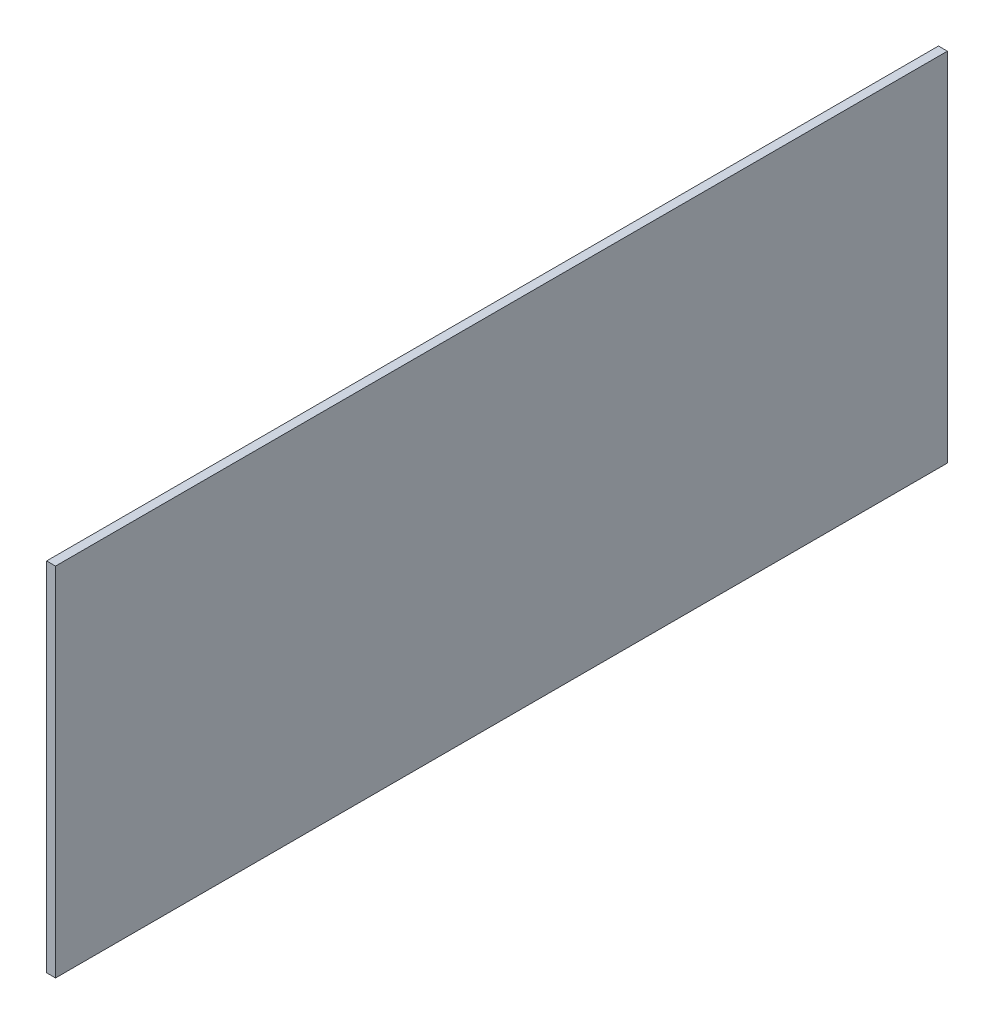
ISO-10303-21;
HEADER;
FILE_DESCRIPTION(('STEP AP214'),'2;1');
FILE_NAME('part.step','',(''),(''),'','','');
FILE_SCHEMA(('AUTOMOTIVE_DESIGN { 1 0 10303 214 1 1 1 1 }'));
ENDSEC;
DATA;
#1=APPLICATION_CONTEXT('core data for automotive mechanical design processes');
#2=APPLICATION_PROTOCOL_DEFINITION('international standard','automotive_design',2000,#1);
#3=PRODUCT_CONTEXT('',#1,'mechanical');
#4=PRODUCT('Part','Part','',(#3));
#5=PRODUCT_RELATED_PRODUCT_CATEGORY('part','',(#4));
#6=PRODUCT_DEFINITION_FORMATION('','',#4);
#7=PRODUCT_DEFINITION_CONTEXT('part definition',#1,'design');
#8=PRODUCT_DEFINITION('design','',#6,#7);
#9=PRODUCT_DEFINITION_SHAPE('','',#8);
#10=(LENGTH_UNIT() NAMED_UNIT(*) SI_UNIT(.MILLI.,.METRE.));
#11=(NAMED_UNIT(*) PLANE_ANGLE_UNIT() SI_UNIT($,.RADIAN.));
#12=(NAMED_UNIT(*) SI_UNIT($,.STERADIAN.) SOLID_ANGLE_UNIT());
#13=UNCERTAINTY_MEASURE_WITH_UNIT(LENGTH_MEASURE(1.E-05),#10,'distance_accuracy_value','');
#14=(GEOMETRIC_REPRESENTATION_CONTEXT(3) GLOBAL_UNCERTAINTY_ASSIGNED_CONTEXT((#13)) GLOBAL_UNIT_ASSIGNED_CONTEXT((#10,
#11,#12)) REPRESENTATION_CONTEXT('',''));
#15=CARTESIAN_POINT('',(0.,0.,0.));
#16=DIRECTION('',(0.,0.,1.));
#17=DIRECTION('',(1.,0.,0.));
#18=AXIS2_PLACEMENT_3D('',#15,#16,#17);
#19=CARTESIAN_POINT('',(10.,-200.,500.));
#20=DIRECTION('',(0.,0.,-1.));
#21=DIRECTION('',(-1.,0.,0.));
#22=AXIS2_PLACEMENT_3D('',#19,#20,#21);
#23=PLANE('',#22);
#24=DIRECTION('',(0.,-1.,0.));
#25=VECTOR('',#24,1.);
#26=CARTESIAN_POINT('',(0.,-200.,500.));
#27=LINE('',#26,#25);
#28=CARTESIAN_POINT('',(0.,200.,500.));
#29=VERTEX_POINT('',#28);
#30=CARTESIAN_POINT('',(0.,-200.,500.));
#31=VERTEX_POINT('',#30);
#32=EDGE_CURVE('E98',#29,#31,#27,.T.);
#33=ORIENTED_EDGE('',*,*,#32,.T.);
#34=DIRECTION('',(-1.,0.,0.));
#35=VECTOR('',#34,1.);
#36=CARTESIAN_POINT('',(10.,-200.,500.));
#37=LINE('',#36,#35);
#38=CARTESIAN_POINT('',(10.,-200.,500.));
#39=VERTEX_POINT('',#38);
#40=EDGE_CURVE('E11',#39,#31,#37,.T.);
#41=ORIENTED_EDGE('',*,*,#40,.F.);
#42=DIRECTION('',(0.,-1.,0.));
#43=VECTOR('',#42,1.);
#44=CARTESIAN_POINT('',(10.,-200.,500.));
#45=LINE('',#44,#43);
#46=CARTESIAN_POINT('',(10.,200.,500.));
#47=VERTEX_POINT('',#46);
#48=EDGE_CURVE('E86',#47,#39,#45,.T.);
#49=ORIENTED_EDGE('',*,*,#48,.F.);
#50=DIRECTION('',(-1.,0.,0.));
#51=VECTOR('',#50,1.);
#52=CARTESIAN_POINT('',(10.,200.,500.));
#53=LINE('',#52,#51);
#54=EDGE_CURVE('E94',#47,#29,#53,.T.);
#55=ORIENTED_EDGE('',*,*,#54,.T.);
#56=EDGE_LOOP('',(#33,#41,#49,#55));
#57=FACE_BOUND('',#56,.T.);
#58=ADVANCED_FACE('F35',(#57),#23,.F.);
#59=CARTESIAN_POINT('',(10.,-200.,-500.));
#60=DIRECTION('',(0.,1.,0.));
#61=DIRECTION('',(0.,0.,1.));
#62=AXIS2_PLACEMENT_3D('',#59,#60,#61);
#63=PLANE('',#62);
#64=DIRECTION('',(0.,0.,-1.));
#65=VECTOR('',#64,1.);
#66=CARTESIAN_POINT('',(0.,-200.,-500.));
#67=LINE('',#66,#65);
#68=CARTESIAN_POINT('',(0.,-200.,-500.));
#69=VERTEX_POINT('',#68);
#70=EDGE_CURVE('E90',#31,#69,#67,.T.);
#71=ORIENTED_EDGE('',*,*,#70,.T.);
#72=DIRECTION('',(-1.,0.,0.));
#73=VECTOR('',#72,1.);
#74=CARTESIAN_POINT('',(10.,-200.,-500.));
#75=LINE('',#74,#73);
#76=CARTESIAN_POINT('',(10.,-200.,-500.));
#77=VERTEX_POINT('',#76);
#78=EDGE_CURVE('E43',#77,#69,#75,.T.);
#79=ORIENTED_EDGE('',*,*,#78,.F.);
#80=DIRECTION('',(0.,0.,-1.));
#81=VECTOR('',#80,1.);
#82=CARTESIAN_POINT('',(10.,-200.,-500.));
#83=LINE('',#82,#81);
#84=EDGE_CURVE('E81',#39,#77,#83,.T.);
#85=ORIENTED_EDGE('',*,*,#84,.F.);
#86=ORIENTED_EDGE('',*,*,#40,.T.);
#87=EDGE_LOOP('',(#71,#79,#85,#86));
#88=FACE_BOUND('',#87,.T.);
#89=ADVANCED_FACE('F89',(#88),#63,.F.);
#90=CARTESIAN_POINT('',(10.,-200.,-500.));
#91=DIRECTION('',(0.,0.,1.));
#92=DIRECTION('',(1.,0.,0.));
#93=AXIS2_PLACEMENT_3D('',#90,#91,#92);
#94=PLANE('',#93);
#95=DIRECTION('',(0.,1.,0.));
#96=VECTOR('',#95,1.);
#97=CARTESIAN_POINT('',(0.,-200.,-500.));
#98=LINE('',#97,#96);
#99=CARTESIAN_POINT('',(0.,200.,-500.));
#100=VERTEX_POINT('',#99);
#101=EDGE_CURVE('E68',#69,#100,#98,.T.);
#102=ORIENTED_EDGE('',*,*,#101,.T.);
#103=DIRECTION('',(-1.,0.,0.));
#104=VECTOR('',#103,1.);
#105=CARTESIAN_POINT('',(10.,200.,-500.));
#106=LINE('',#105,#104);
#107=CARTESIAN_POINT('',(10.,200.,-500.));
#108=VERTEX_POINT('',#107);
#109=EDGE_CURVE('E91',#108,#100,#106,.T.);
#110=ORIENTED_EDGE('',*,*,#109,.F.);
#111=DIRECTION('',(0.,1.,0.));
#112=VECTOR('',#111,1.);
#113=CARTESIAN_POINT('',(10.,-200.,-500.));
#114=LINE('',#113,#112);
#115=EDGE_CURVE('E84',#77,#108,#114,.T.);
#116=ORIENTED_EDGE('',*,*,#115,.F.);
#117=ORIENTED_EDGE('',*,*,#78,.T.);
#118=EDGE_LOOP('',(#102,#110,#116,#117));
#119=FACE_BOUND('',#118,.T.);
#120=ADVANCED_FACE('F92',(#119),#94,.F.);
#121=CARTESIAN_POINT('',(10.,200.,-500.));
#122=DIRECTION('',(0.,-1.,0.));
#123=DIRECTION('',(0.,0.,-1.));
#124=AXIS2_PLACEMENT_3D('',#121,#122,#123);
#125=PLANE('',#124);
#126=DIRECTION('',(0.,0.,1.));
#127=VECTOR('',#126,1.);
#128=CARTESIAN_POINT('',(0.,200.,-500.));
#129=LINE('',#128,#127);
#130=EDGE_CURVE('E74',#100,#29,#129,.T.);
#131=ORIENTED_EDGE('',*,*,#130,.T.);
#132=ORIENTED_EDGE('',*,*,#54,.F.);
#133=DIRECTION('',(0.,0.,1.));
#134=VECTOR('',#133,1.);
#135=CARTESIAN_POINT('',(10.,200.,-500.));
#136=LINE('',#135,#134);
#137=EDGE_CURVE('E51',#108,#47,#136,.T.);
#138=ORIENTED_EDGE('',*,*,#137,.F.);
#139=ORIENTED_EDGE('',*,*,#109,.T.);
#140=EDGE_LOOP('',(#131,#132,#138,#139));
#141=FACE_BOUND('',#140,.T.);
#142=ADVANCED_FACE('F105',(#141),#125,.F.);
#143=CARTESIAN_POINT('',(10.,0.,0.));
#144=DIRECTION('',(1.,0.,0.));
#145=DIRECTION('',(0.,0.,-1.));
#146=AXIS2_PLACEMENT_3D('',#143,#144,#145);
#147=PLANE('',#146);
#148=ORIENTED_EDGE('',*,*,#48,.T.);
#149=ORIENTED_EDGE('',*,*,#84,.T.);
#150=ORIENTED_EDGE('',*,*,#115,.T.);
#151=ORIENTED_EDGE('',*,*,#137,.T.);
#152=EDGE_LOOP('',(#148,#149,#150,#151));
#153=FACE_BOUND('',#152,.T.);
#154=ADVANCED_FACE('F82',(#153),#147,.T.);
#155=CARTESIAN_POINT('',(0.,0.,0.));
#156=DIRECTION('',(1.,0.,0.));
#157=DIRECTION('',(0.,0.,-1.));
#158=AXIS2_PLACEMENT_3D('',#155,#156,#157);
#159=PLANE('',#158);
#160=ORIENTED_EDGE('',*,*,#32,.F.);
#161=ORIENTED_EDGE('',*,*,#130,.F.);
#162=ORIENTED_EDGE('',*,*,#101,.F.);
#163=ORIENTED_EDGE('',*,*,#70,.F.);
#164=EDGE_LOOP('',(#160,#161,#162,#163));
#165=FACE_BOUND('',#164,.T.);
#166=ADVANCED_FACE('F108',(#165),#159,.F.);
#167=CLOSED_SHELL('',(#58,#89,#120,#142,#154,#166));
#168=MANIFOLD_SOLID_BREP('B2',#167);
#169=ADVANCED_BREP_SHAPE_REPRESENTATION('',(#18,#168),#14);
#170=SHAPE_DEFINITION_REPRESENTATION(#9,#169);
ENDSEC;
END-ISO-10303-21;
